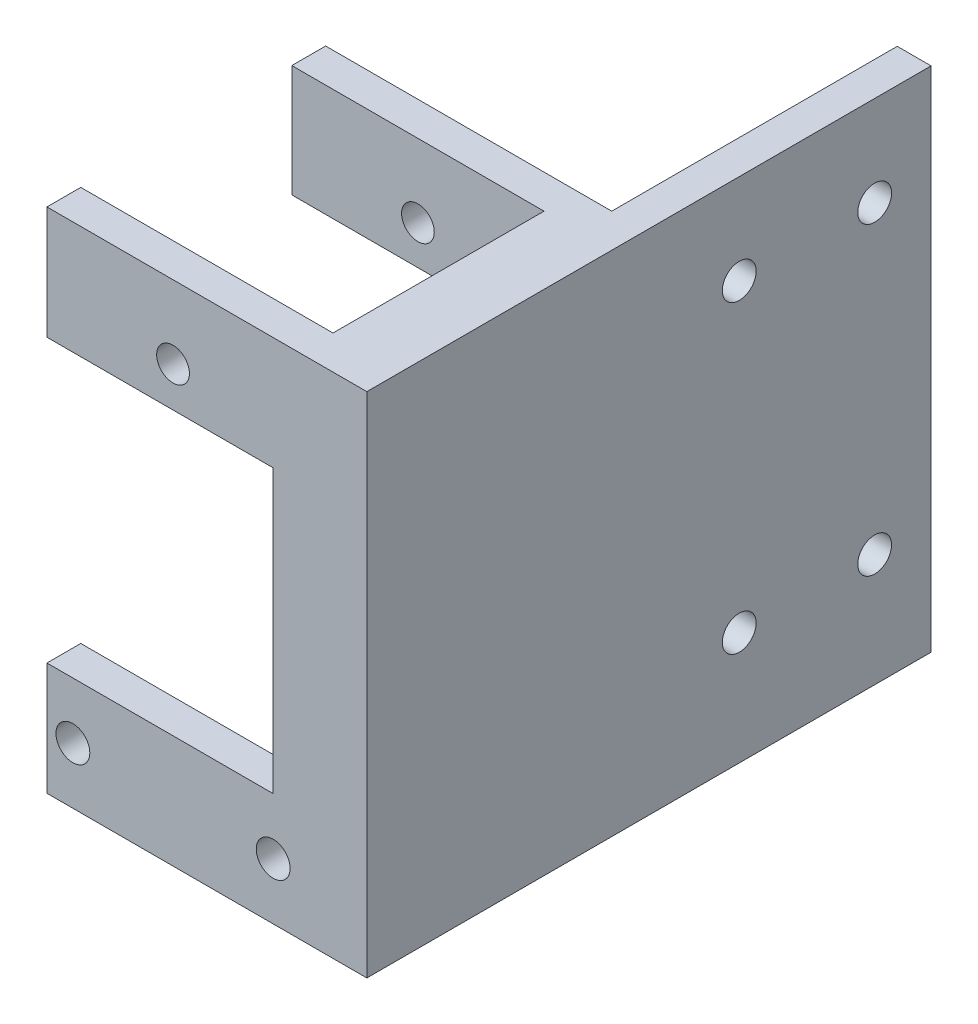
ISO-10303-21;
HEADER;
FILE_DESCRIPTION(('STEP AP214'),'2;1');
FILE_NAME('part.step','',(''),(''),'','','');
FILE_SCHEMA(('AUTOMOTIVE_DESIGN { 1 0 10303 214 1 1 1 1 }'));
ENDSEC;
DATA;
#1=APPLICATION_CONTEXT('core data for automotive mechanical design processes');
#2=APPLICATION_PROTOCOL_DEFINITION('international standard','automotive_design',2000,#1);
#3=PRODUCT_CONTEXT('',#1,'mechanical');
#4=PRODUCT('Part','Part','',(#3));
#5=PRODUCT_RELATED_PRODUCT_CATEGORY('part','',(#4));
#6=PRODUCT_DEFINITION_FORMATION('','',#4);
#7=PRODUCT_DEFINITION_CONTEXT('part definition',#1,'design');
#8=PRODUCT_DEFINITION('design','',#6,#7);
#9=PRODUCT_DEFINITION_SHAPE('','',#8);
#10=(LENGTH_UNIT() NAMED_UNIT(*) SI_UNIT(.MILLI.,.METRE.));
#11=(NAMED_UNIT(*) PLANE_ANGLE_UNIT() SI_UNIT($,.RADIAN.));
#12=(NAMED_UNIT(*) SI_UNIT($,.STERADIAN.) SOLID_ANGLE_UNIT());
#13=UNCERTAINTY_MEASURE_WITH_UNIT(LENGTH_MEASURE(1.E-05),#10,'distance_accuracy_value','');
#14=(GEOMETRIC_REPRESENTATION_CONTEXT(3) GLOBAL_UNCERTAINTY_ASSIGNED_CONTEXT((#13)) GLOBAL_UNIT_ASSIGNED_CONTEXT((#10,
#11,#12)) REPRESENTATION_CONTEXT('',''));
#15=CARTESIAN_POINT('',(0.,0.,0.));
#16=DIRECTION('',(0.,0.,1.));
#17=DIRECTION('',(1.,0.,0.));
#18=AXIS2_PLACEMENT_3D('',#15,#16,#17);
#19=CARTESIAN_POINT('',(0.,-22.5,-3.));
#20=DIRECTION('',(0.,1.,0.));
#21=DIRECTION('',(-1.,0.,0.));
#22=AXIS2_PLACEMENT_3D('',#19,#20,#21);
#23=PLANE('',#22);
#24=DIRECTION('',(0.,0.,1.));
#25=VECTOR('',#24,1.);
#26=CARTESIAN_POINT('',(9.675,-22.5,-21.7));
#27=LINE('',#26,#25);
#28=CARTESIAN_POINT('',(9.675,-22.5,-21.7));
#29=VERTEX_POINT('',#28);
#30=CARTESIAN_POINT('',(9.675,-22.5,-3.));
#31=VERTEX_POINT('',#30);
#32=EDGE_CURVE('E145',#29,#31,#27,.T.);
#33=ORIENTED_EDGE('',*,*,#32,.F.);
#34=DIRECTION('',(1.,0.,0.));
#35=VECTOR('',#34,1.);
#36=CARTESIAN_POINT('',(15.675,-22.5,-21.7));
#37=LINE('',#36,#35);
#38=CARTESIAN_POINT('',(-12.675,-22.5,-21.7));
#39=VERTEX_POINT('',#38);
#40=EDGE_CURVE('E257',#39,#29,#37,.T.);
#41=ORIENTED_EDGE('',*,*,#40,.F.);
#42=DIRECTION('',(0.,0.,1.));
#43=VECTOR('',#42,1.);
#44=CARTESIAN_POINT('',(-12.675,-22.5,-26.7));
#45=LINE('',#44,#43);
#46=CARTESIAN_POINT('',(-12.675,-22.5,-24.7));
#47=VERTEX_POINT('',#46);
#48=EDGE_CURVE('E420',#47,#39,#45,.T.);
#49=ORIENTED_EDGE('',*,*,#48,.F.);
#50=DIRECTION('',(-1.,0.,0.));
#51=VECTOR('',#50,1.);
#52=CARTESIAN_POINT('',(15.675,-22.5,-24.7));
#53=LINE('',#52,#51);
#54=CARTESIAN_POINT('',(12.675,-22.5,-24.7));
#55=VERTEX_POINT('',#54);
#56=EDGE_CURVE('E278',#55,#47,#53,.T.);
#57=ORIENTED_EDGE('',*,*,#56,.F.);
#58=DIRECTION('',(0.,0.,-1.));
#59=VECTOR('',#58,1.);
#60=CARTESIAN_POINT('',(12.675,-22.5,0.));
#61=LINE('',#60,#59);
#62=CARTESIAN_POINT('',(12.675,-22.5,-50.));
#63=VERTEX_POINT('',#62);
#64=EDGE_CURVE('E281',#55,#63,#61,.T.);
#65=ORIENTED_EDGE('',*,*,#64,.T.);
#66=DIRECTION('',(-1.,0.,0.));
#67=VECTOR('',#66,1.);
#68=CARTESIAN_POINT('',(15.675,-22.5,-50.));
#69=LINE('',#68,#67);
#70=CARTESIAN_POINT('',(15.675,-22.5,-50.));
#71=VERTEX_POINT('',#70);
#72=EDGE_CURVE('E311',#71,#63,#69,.T.);
#73=ORIENTED_EDGE('',*,*,#72,.F.);
#74=DIRECTION('',(0.,0.,-1.));
#75=VECTOR('',#74,1.);
#76=CARTESIAN_POINT('',(15.675,-22.5,0.));
#77=LINE('',#76,#75);
#78=CARTESIAN_POINT('',(15.675,-22.5,0.));
#79=VERTEX_POINT('',#78);
#80=EDGE_CURVE('E296',#79,#71,#77,.T.);
#81=ORIENTED_EDGE('',*,*,#80,.F.);
#82=DIRECTION('',(-1.,0.,0.));
#83=VECTOR('',#82,1.);
#84=CARTESIAN_POINT('',(0.,-22.5,0.));
#85=LINE('',#84,#83);
#86=CARTESIAN_POINT('',(-12.675,-22.5,0.));
#87=VERTEX_POINT('',#86);
#88=EDGE_CURVE('E358',#79,#87,#85,.T.);
#89=ORIENTED_EDGE('',*,*,#88,.T.);
#90=DIRECTION('',(0.,0.,1.));
#91=VECTOR('',#90,1.);
#92=CARTESIAN_POINT('',(-12.675,-22.5,-3.));
#93=LINE('',#92,#91);
#94=CARTESIAN_POINT('',(-12.675,-22.5,-3.));
#95=VERTEX_POINT('',#94);
#96=EDGE_CURVE('E368',#95,#87,#93,.T.);
#97=ORIENTED_EDGE('',*,*,#96,.F.);
#98=DIRECTION('',(-1.,0.,0.));
#99=VECTOR('',#98,1.);
#100=CARTESIAN_POINT('',(0.,-22.5,-3.));
#101=LINE('',#100,#99);
#102=EDGE_CURVE('E259',#31,#95,#101,.T.);
#103=ORIENTED_EDGE('',*,*,#102,.F.);
#104=EDGE_LOOP('',(#33,#41,#49,#57,#65,#73,#81,#89,#97,#103));
#105=FACE_BOUND('',#104,.T.);
#106=ADVANCED_FACE('F128',(#105),#23,.F.);
#107=CARTESIAN_POINT('',(0.,22.5,-3.));
#108=DIRECTION('',(0.,1.,0.));
#109=DIRECTION('',(-1.,0.,0.));
#110=AXIS2_PLACEMENT_3D('',#107,#108,#109);
#111=PLANE('',#110);
#112=DIRECTION('',(-1.,0.,0.));
#113=VECTOR('',#112,1.);
#114=CARTESIAN_POINT('',(15.675,22.5,-24.7));
#115=LINE('',#114,#113);
#116=CARTESIAN_POINT('',(12.675,22.5,-24.7));
#117=VERTEX_POINT('',#116);
#118=CARTESIAN_POINT('',(-12.675,22.5,-24.7));
#119=VERTEX_POINT('',#118);
#120=EDGE_CURVE('E288',#117,#119,#115,.T.);
#121=ORIENTED_EDGE('',*,*,#120,.T.);
#122=DIRECTION('',(0.,0.,1.));
#123=VECTOR('',#122,1.);
#124=CARTESIAN_POINT('',(-12.675,22.5,-26.7));
#125=LINE('',#124,#123);
#126=CARTESIAN_POINT('',(-12.675,22.5,-21.7));
#127=VERTEX_POINT('',#126);
#128=EDGE_CURVE('E422',#119,#127,#125,.T.);
#129=ORIENTED_EDGE('',*,*,#128,.T.);
#130=DIRECTION('',(1.,0.,0.));
#131=VECTOR('',#130,1.);
#132=CARTESIAN_POINT('',(15.675,22.5,-21.7));
#133=LINE('',#132,#131);
#134=CARTESIAN_POINT('',(9.675,22.5,-21.7));
#135=VERTEX_POINT('',#134);
#136=EDGE_CURVE('E284',#127,#135,#133,.T.);
#137=ORIENTED_EDGE('',*,*,#136,.T.);
#138=DIRECTION('',(0.,0.,-1.));
#139=VECTOR('',#138,1.);
#140=CARTESIAN_POINT('',(9.675,22.5,-21.7));
#141=LINE('',#140,#139);
#142=CARTESIAN_POINT('',(9.675,22.5,-3.));
#143=VERTEX_POINT('',#142);
#144=EDGE_CURVE('E266',#143,#135,#141,.T.);
#145=ORIENTED_EDGE('',*,*,#144,.F.);
#146=DIRECTION('',(-1.,0.,0.));
#147=VECTOR('',#146,1.);
#148=CARTESIAN_POINT('',(0.,22.5,-3.));
#149=LINE('',#148,#147);
#150=CARTESIAN_POINT('',(-12.675,22.5,-3.));
#151=VERTEX_POINT('',#150);
#152=EDGE_CURVE('E315',#143,#151,#149,.T.);
#153=ORIENTED_EDGE('',*,*,#152,.T.);
#154=DIRECTION('',(0.,0.,1.));
#155=VECTOR('',#154,1.);
#156=CARTESIAN_POINT('',(-12.675,22.5,-3.));
#157=LINE('',#156,#155);
#158=CARTESIAN_POINT('',(-12.675,22.5,0.));
#159=VERTEX_POINT('',#158);
#160=EDGE_CURVE('E341',#151,#159,#157,.T.);
#161=ORIENTED_EDGE('',*,*,#160,.T.);
#162=DIRECTION('',(-1.,0.,0.));
#163=VECTOR('',#162,1.);
#164=CARTESIAN_POINT('',(0.,22.5,0.));
#165=LINE('',#164,#163);
#166=CARTESIAN_POINT('',(15.675,22.5,0.));
#167=VERTEX_POINT('',#166);
#168=EDGE_CURVE('E314',#167,#159,#165,.T.);
#169=ORIENTED_EDGE('',*,*,#168,.F.);
#170=DIRECTION('',(0.,0.,1.));
#171=VECTOR('',#170,1.);
#172=CARTESIAN_POINT('',(15.675,22.5,0.));
#173=LINE('',#172,#171);
#174=CARTESIAN_POINT('',(15.675,22.5,-50.));
#175=VERTEX_POINT('',#174);
#176=EDGE_CURVE('E301',#175,#167,#173,.T.);
#177=ORIENTED_EDGE('',*,*,#176,.F.);
#178=DIRECTION('',(-1.,0.,0.));
#179=VECTOR('',#178,1.);
#180=CARTESIAN_POINT('',(15.675,22.5,-50.));
#181=LINE('',#180,#179);
#182=CARTESIAN_POINT('',(12.675,22.5,-50.));
#183=VERTEX_POINT('',#182);
#184=EDGE_CURVE('E303',#175,#183,#181,.T.);
#185=ORIENTED_EDGE('',*,*,#184,.T.);
#186=DIRECTION('',(0.,0.,1.));
#187=VECTOR('',#186,1.);
#188=CARTESIAN_POINT('',(12.675,22.5,0.));
#189=LINE('',#188,#187);
#190=EDGE_CURVE('E297',#183,#117,#189,.T.);
#191=ORIENTED_EDGE('',*,*,#190,.T.);
#192=EDGE_LOOP('',(#121,#129,#137,#145,#153,#161,#169,#177,#185,#191));
#193=FACE_BOUND('',#192,.T.);
#194=ADVANCED_FACE('F130',(#193),#111,.T.);
#195=CARTESIAN_POINT('',(15.675,-22.5,-21.7));
#196=DIRECTION('',(0.,0.,1.));
#197=DIRECTION('',(1.,0.,0.));
#198=AXIS2_PLACEMENT_3D('',#195,#196,#197);
#199=PLANE('',#198);
#200=DIRECTION('',(0.,-1.,0.));
#201=VECTOR('',#200,1.);
#202=CARTESIAN_POINT('',(9.675,22.5,-21.7));
#203=LINE('',#202,#201);
#204=EDGE_CURVE('E261',#135,#29,#203,.T.);
#205=ORIENTED_EDGE('',*,*,#204,.F.);
#206=ORIENTED_EDGE('',*,*,#136,.F.);
#207=DIRECTION('',(0.,-1.,0.));
#208=VECTOR('',#207,1.);
#209=CARTESIAN_POINT('',(-12.675,0.,-21.7));
#210=LINE('',#209,#208);
#211=CARTESIAN_POINT('',(-12.675,12.572802408595,-21.7));
#212=VERTEX_POINT('',#211);
#213=EDGE_CURVE('E414',#127,#212,#210,.T.);
#214=ORIENTED_EDGE('',*,*,#213,.T.);
#215=DIRECTION('',(1.,0.,0.));
#216=VECTOR('',#215,1.);
#217=CARTESIAN_POINT('',(0.,12.572802408595,-21.7));
#218=LINE('',#217,#216);
#219=CARTESIAN_POINT('',(7.37500000000001,12.572802408595,-21.7));
#220=VERTEX_POINT('',#219);
#221=EDGE_CURVE('E407',#212,#220,#218,.T.);
#222=ORIENTED_EDGE('',*,*,#221,.T.);
#223=DIRECTION('',(0.,1.,0.));
#224=VECTOR('',#223,1.);
#225=CARTESIAN_POINT('',(7.37500000000001,0.,-21.7));
#226=LINE('',#225,#224);
#227=CARTESIAN_POINT('',(7.37500000000001,-12.5,-21.7));
#228=VERTEX_POINT('',#227);
#229=EDGE_CURVE('E402',#228,#220,#226,.T.);
#230=ORIENTED_EDGE('',*,*,#229,.F.);
#231=DIRECTION('',(1.,0.,0.));
#232=VECTOR('',#231,1.);
#233=CARTESIAN_POINT('',(0.,-12.5,-21.7));
#234=LINE('',#233,#232);
#235=CARTESIAN_POINT('',(-12.675,-12.5,-21.7));
#236=VERTEX_POINT('',#235);
#237=EDGE_CURVE('E398',#236,#228,#234,.T.);
#238=ORIENTED_EDGE('',*,*,#237,.F.);
#239=DIRECTION('',(0.,-1.,0.));
#240=VECTOR('',#239,1.);
#241=CARTESIAN_POINT('',(-12.675,0.,-21.7));
#242=LINE('',#241,#240);
#243=EDGE_CURVE('E276',#236,#39,#242,.T.);
#244=ORIENTED_EDGE('',*,*,#243,.T.);
#245=ORIENTED_EDGE('',*,*,#40,.T.);
#246=EDGE_LOOP('',(#205,#206,#214,#222,#230,#238,#244,#245));
#247=FACE_BOUND('',#246,.T.);
#248=CARTESIAN_POINT('',(7.375,-17.5,-21.7));
#249=DIRECTION('',(0.,0.,1.));
#250=DIRECTION('',(1.,0.,0.));
#251=AXIS2_PLACEMENT_3D('',#248,#249,#250);
#252=CIRCLE('',#251,1.5);
#253=CARTESIAN_POINT('',(8.875,-17.5,-21.7));
#254=VERTEX_POINT('',#253);
#255=EDGE_CURVE('E502',#254,#254,#252,.T.);
#256=ORIENTED_EDGE('',*,*,#255,.F.);
#257=EDGE_LOOP('',(#256));
#258=FACE_BOUND('',#257,.T.);
#259=CARTESIAN_POINT('',(-10.375,-17.5,-21.7));
#260=DIRECTION('',(0.,0.,1.));
#261=DIRECTION('',(1.,0.,0.));
#262=AXIS2_PLACEMENT_3D('',#259,#260,#261);
#263=CIRCLE('',#262,1.5);
#264=CARTESIAN_POINT('',(-8.875,-17.5,-21.7));
#265=VERTEX_POINT('',#264);
#266=EDGE_CURVE('E501',#265,#265,#263,.T.);
#267=ORIENTED_EDGE('',*,*,#266,.F.);
#268=EDGE_LOOP('',(#267));
#269=FACE_BOUND('',#268,.T.);
#270=CARTESIAN_POINT('',(-1.49999999999866,16.0249999999949,-21.7));
#271=DIRECTION('',(0.,0.,1.));
#272=DIRECTION('',(1.,0.,0.));
#273=AXIS2_PLACEMENT_3D('',#270,#271,#272);
#274=CIRCLE('',#273,1.4500000000001);
#275=CARTESIAN_POINT('',(-0.049999999998559,16.0249999999949,-21.7));
#276=VERTEX_POINT('',#275);
#277=EDGE_CURVE('E393',#276,#276,#274,.T.);
#278=ORIENTED_EDGE('',*,*,#277,.F.);
#279=EDGE_LOOP('',(#278));
#280=FACE_BOUND('',#279,.T.);
#281=ADVANCED_FACE('F272',(#247,#258,#269,#280),#199,.T.);
#282=CARTESIAN_POINT('',(15.675,-22.5,-24.7));
#283=DIRECTION('',(0.,0.,-1.));
#284=DIRECTION('',(-1.,0.,0.));
#285=AXIS2_PLACEMENT_3D('',#282,#283,#284);
#286=PLANE('',#285);
#287=CARTESIAN_POINT('',(7.375,-17.5,-24.7));
#288=DIRECTION('',(0.,0.,-1.));
#289=DIRECTION('',(-1.,0.,0.));
#290=AXIS2_PLACEMENT_3D('',#287,#288,#289);
#291=CIRCLE('',#290,1.5);
#292=CARTESIAN_POINT('',(5.875,-17.5,-24.7));
#293=VERTEX_POINT('',#292);
#294=EDGE_CURVE('E132',#293,#293,#291,.T.);
#295=ORIENTED_EDGE('',*,*,#294,.F.);
#296=EDGE_LOOP('',(#295));
#297=FACE_BOUND('',#296,.T.);
#298=CARTESIAN_POINT('',(-10.375,-17.5,-24.7));
#299=DIRECTION('',(0.,0.,-1.));
#300=DIRECTION('',(-1.,0.,0.));
#301=AXIS2_PLACEMENT_3D('',#298,#299,#300);
#302=CIRCLE('',#301,1.5);
#303=CARTESIAN_POINT('',(-11.875,-17.5,-24.7));
#304=VERTEX_POINT('',#303);
#305=EDGE_CURVE('E392',#304,#304,#302,.T.);
#306=ORIENTED_EDGE('',*,*,#305,.F.);
#307=EDGE_LOOP('',(#306));
#308=FACE_BOUND('',#307,.T.);
#309=CARTESIAN_POINT('',(-1.49999999999866,16.0249999999949,-24.7));
#310=DIRECTION('',(0.,0.,-1.));
#311=DIRECTION('',(-1.,0.,0.));
#312=AXIS2_PLACEMENT_3D('',#309,#310,#311);
#313=CIRCLE('',#312,1.4500000000001);
#314=CARTESIAN_POINT('',(-2.94999999999875,16.0249999999949,-24.7));
#315=VERTEX_POINT('',#314);
#316=EDGE_CURVE('E390',#315,#315,#313,.T.);
#317=ORIENTED_EDGE('',*,*,#316,.F.);
#318=EDGE_LOOP('',(#317));
#319=FACE_BOUND('',#318,.T.);
#320=ORIENTED_EDGE('',*,*,#56,.T.);
#321=DIRECTION('',(0.,1.,0.));
#322=VECTOR('',#321,1.);
#323=CARTESIAN_POINT('',(-12.675,-22.5,-24.7));
#324=LINE('',#323,#322);
#325=CARTESIAN_POINT('',(-12.675,-12.5,-24.7));
#326=VERTEX_POINT('',#325);
#327=EDGE_CURVE('E12',#47,#326,#324,.T.);
#328=ORIENTED_EDGE('',*,*,#327,.T.);
#329=DIRECTION('',(-1.,0.,0.));
#330=VECTOR('',#329,1.);
#331=CARTESIAN_POINT('',(15.675,-12.5,-24.7));
#332=LINE('',#331,#330);
#333=CARTESIAN_POINT('',(7.37500000000001,-12.5,-24.7));
#334=VERTEX_POINT('',#333);
#335=EDGE_CURVE('E137',#334,#326,#332,.T.);
#336=ORIENTED_EDGE('',*,*,#335,.F.);
#337=DIRECTION('',(0.,-1.,0.));
#338=VECTOR('',#337,1.);
#339=CARTESIAN_POINT('',(7.37500000000001,-22.5,-24.7));
#340=LINE('',#339,#338);
#341=CARTESIAN_POINT('',(7.37500000000001,12.572802408595,-24.7));
#342=VERTEX_POINT('',#341);
#343=EDGE_CURVE('E371',#342,#334,#340,.T.);
#344=ORIENTED_EDGE('',*,*,#343,.F.);
#345=DIRECTION('',(-1.,0.,0.));
#346=VECTOR('',#345,1.);
#347=CARTESIAN_POINT('',(15.675,12.572802408595,-24.7));
#348=LINE('',#347,#346);
#349=CARTESIAN_POINT('',(-12.675,12.572802408595,-24.7));
#350=VERTEX_POINT('',#349);
#351=EDGE_CURVE('E383',#342,#350,#348,.T.);
#352=ORIENTED_EDGE('',*,*,#351,.T.);
#353=DIRECTION('',(0.,1.,0.));
#354=VECTOR('',#353,1.);
#355=CARTESIAN_POINT('',(-12.675,-22.5,-24.7));
#356=LINE('',#355,#354);
#357=EDGE_CURVE('E386',#350,#119,#356,.T.);
#358=ORIENTED_EDGE('',*,*,#357,.T.);
#359=ORIENTED_EDGE('',*,*,#120,.F.);
#360=DIRECTION('',(0.,1.,0.));
#361=VECTOR('',#360,1.);
#362=CARTESIAN_POINT('',(12.675,0.,-24.7));
#363=LINE('',#362,#361);
#364=EDGE_CURVE('E277',#55,#117,#363,.T.);
#365=ORIENTED_EDGE('',*,*,#364,.F.);
#366=EDGE_LOOP('',(#320,#328,#336,#344,#352,#358,#359,#365));
#367=FACE_BOUND('',#366,.T.);
#368=ADVANCED_FACE('F433',(#297,#308,#319,#367),#286,.T.);
#369=CARTESIAN_POINT('',(-12.675,0.,-3.));
#370=DIRECTION('',(1.,0.,0.));
#371=DIRECTION('',(0.,0.,-1.));
#372=AXIS2_PLACEMENT_3D('',#369,#370,#371);
#373=PLANE('',#372);
#374=DIRECTION('',(0.,1.,0.));
#375=VECTOR('',#374,1.);
#376=CARTESIAN_POINT('',(-12.675,0.,0.));
#377=LINE('',#376,#375);
#378=CARTESIAN_POINT('',(-12.675,-12.5,0.));
#379=VERTEX_POINT('',#378);
#380=EDGE_CURVE('E356',#87,#379,#377,.T.);
#381=ORIENTED_EDGE('',*,*,#380,.T.);
#382=DIRECTION('',(0.,0.,1.));
#383=VECTOR('',#382,1.);
#384=CARTESIAN_POINT('',(-12.675,-12.5,-3.));
#385=LINE('',#384,#383);
#386=CARTESIAN_POINT('',(-12.675,-12.5,-3.));
#387=VERTEX_POINT('',#386);
#388=EDGE_CURVE('E372',#387,#379,#385,.T.);
#389=ORIENTED_EDGE('',*,*,#388,.F.);
#390=DIRECTION('',(0.,1.,0.));
#391=VECTOR('',#390,1.);
#392=CARTESIAN_POINT('',(-12.675,0.,-3.));
#393=LINE('',#392,#391);
#394=EDGE_CURVE('E329',#95,#387,#393,.T.);
#395=ORIENTED_EDGE('',*,*,#394,.F.);
#396=ORIENTED_EDGE('',*,*,#96,.T.);
#397=EDGE_LOOP('',(#381,#389,#395,#396));
#398=FACE_BOUND('',#397,.T.);
#399=ADVANCED_FACE('F458',(#398),#373,.F.);
#400=CARTESIAN_POINT('',(0.,-12.5,-3.));
#401=DIRECTION('',(0.,-1.,0.));
#402=DIRECTION('',(0.,0.,-1.));
#403=AXIS2_PLACEMENT_3D('',#400,#401,#402);
#404=PLANE('',#403);
#405=DIRECTION('',(1.,0.,0.));
#406=VECTOR('',#405,1.);
#407=CARTESIAN_POINT('',(0.,-12.5,0.));
#408=LINE('',#407,#406);
#409=CARTESIAN_POINT('',(7.37500000000001,-12.5,0.));
#410=VERTEX_POINT('',#409);
#411=EDGE_CURVE('E353',#379,#410,#408,.T.);
#412=ORIENTED_EDGE('',*,*,#411,.T.);
#413=DIRECTION('',(0.,0.,1.));
#414=VECTOR('',#413,1.);
#415=CARTESIAN_POINT('',(7.37500000000001,-12.5,-3.));
#416=LINE('',#415,#414);
#417=CARTESIAN_POINT('',(7.37500000000001,-12.5,-3.));
#418=VERTEX_POINT('',#417);
#419=EDGE_CURVE('E375',#418,#410,#416,.T.);
#420=ORIENTED_EDGE('',*,*,#419,.F.);
#421=DIRECTION('',(1.,0.,0.));
#422=VECTOR('',#421,1.);
#423=CARTESIAN_POINT('',(0.,-12.5,-3.));
#424=LINE('',#423,#422);
#425=EDGE_CURVE('E327',#387,#418,#424,.T.);
#426=ORIENTED_EDGE('',*,*,#425,.F.);
#427=ORIENTED_EDGE('',*,*,#388,.T.);
#428=EDGE_LOOP('',(#412,#420,#426,#427));
#429=FACE_BOUND('',#428,.T.);
#430=ADVANCED_FACE('F466',(#429),#404,.F.);
#431=CARTESIAN_POINT('',(7.375,0.,-3.));
#432=DIRECTION('',(-1.,0.,0.));
#433=DIRECTION('',(0.,-1.,0.));
#434=AXIS2_PLACEMENT_3D('',#431,#432,#433);
#435=PLANE('',#434);
#436=DIRECTION('',(0.,-1.,0.));
#437=VECTOR('',#436,1.);
#438=CARTESIAN_POINT('',(7.375,0.,0.));
#439=LINE('',#438,#437);
#440=CARTESIAN_POINT('',(7.375,12.5,0.));
#441=VERTEX_POINT('',#440);
#442=EDGE_CURVE('E350',#441,#410,#439,.T.);
#443=ORIENTED_EDGE('',*,*,#442,.F.);
#444=DIRECTION('',(0.,0.,1.));
#445=VECTOR('',#444,1.);
#446=CARTESIAN_POINT('',(7.375,12.5,-3.));
#447=LINE('',#446,#445);
#448=CARTESIAN_POINT('',(7.375,12.5,-3.));
#449=VERTEX_POINT('',#448);
#450=EDGE_CURVE('E377',#449,#441,#447,.T.);
#451=ORIENTED_EDGE('',*,*,#450,.F.);
#452=DIRECTION('',(0.,-1.,0.));
#453=VECTOR('',#452,1.);
#454=CARTESIAN_POINT('',(7.375,0.,-3.));
#455=LINE('',#454,#453);
#456=EDGE_CURVE('E324',#449,#418,#455,.T.);
#457=ORIENTED_EDGE('',*,*,#456,.T.);
#458=ORIENTED_EDGE('',*,*,#419,.T.);
#459=EDGE_LOOP('',(#443,#451,#457,#458));
#460=FACE_BOUND('',#459,.T.);
#461=ADVANCED_FACE('F543',(#460),#435,.T.);
#462=CARTESIAN_POINT('',(0.,12.5,-3.));
#463=DIRECTION('',(0.,-1.,0.));
#464=DIRECTION('',(0.,0.,-1.));
#465=AXIS2_PLACEMENT_3D('',#462,#463,#464);
#466=PLANE('',#465);
#467=DIRECTION('',(1.,0.,0.));
#468=VECTOR('',#467,1.);
#469=CARTESIAN_POINT('',(0.,12.5,0.));
#470=LINE('',#469,#468);
#471=CARTESIAN_POINT('',(-12.675,12.5,0.));
#472=VERTEX_POINT('',#471);
#473=EDGE_CURVE('E347',#472,#441,#470,.T.);
#474=ORIENTED_EDGE('',*,*,#473,.F.);
#475=DIRECTION('',(0.,0.,1.));
#476=VECTOR('',#475,1.);
#477=CARTESIAN_POINT('',(-12.675,12.5,-3.));
#478=LINE('',#477,#476);
#479=CARTESIAN_POINT('',(-12.675,12.5,-3.));
#480=VERTEX_POINT('',#479);
#481=EDGE_CURVE('E379',#480,#472,#478,.T.);
#482=ORIENTED_EDGE('',*,*,#481,.F.);
#483=DIRECTION('',(1.,0.,0.));
#484=VECTOR('',#483,1.);
#485=CARTESIAN_POINT('',(0.,12.5,-3.));
#486=LINE('',#485,#484);
#487=EDGE_CURVE('E321',#480,#449,#486,.T.);
#488=ORIENTED_EDGE('',*,*,#487,.T.);
#489=ORIENTED_EDGE('',*,*,#450,.T.);
#490=EDGE_LOOP('',(#474,#482,#488,#489));
#491=FACE_BOUND('',#490,.T.);
#492=ADVANCED_FACE('F546',(#491),#466,.T.);
#493=CARTESIAN_POINT('',(-12.675,0.,-3.));
#494=DIRECTION('',(1.,0.,0.));
#495=DIRECTION('',(0.,0.,-1.));
#496=AXIS2_PLACEMENT_3D('',#493,#494,#495);
#497=PLANE('',#496);
#498=DIRECTION('',(0.,1.,0.));
#499=VECTOR('',#498,1.);
#500=CARTESIAN_POINT('',(-12.675,0.,0.));
#501=LINE('',#500,#499);
#502=EDGE_CURVE('E344',#472,#159,#501,.T.);
#503=ORIENTED_EDGE('',*,*,#502,.T.);
#504=ORIENTED_EDGE('',*,*,#160,.F.);
#505=DIRECTION('',(0.,1.,0.));
#506=VECTOR('',#505,1.);
#507=CARTESIAN_POINT('',(-12.675,0.,-3.));
#508=LINE('',#507,#506);
#509=EDGE_CURVE('E317',#480,#151,#508,.T.);
#510=ORIENTED_EDGE('',*,*,#509,.F.);
#511=ORIENTED_EDGE('',*,*,#481,.T.);
#512=EDGE_LOOP('',(#503,#504,#510,#511));
#513=FACE_BOUND('',#512,.T.);
#514=ADVANCED_FACE('F549',(#513),#497,.F.);
#515=CARTESIAN_POINT('',(7.375,-17.5,-3.));
#516=DIRECTION('',(0.,0.,1.));
#517=DIRECTION('',(1.,0.,0.));
#518=AXIS2_PLACEMENT_3D('',#515,#516,#517);
#519=CYLINDRICAL_SURFACE('',#518,1.5);
#520=CARTESIAN_POINT('',(7.375,-17.5,-3.));
#521=DIRECTION('',(0.,0.,1.));
#522=DIRECTION('',(1.,0.,0.));
#523=AXIS2_PLACEMENT_3D('',#520,#521,#522);
#524=CIRCLE('',#523,1.5);
#525=CARTESIAN_POINT('',(8.875,-17.5,-3.));
#526=VERTEX_POINT('',#525);
#527=EDGE_CURVE('E335',#526,#526,#524,.T.);
#528=ORIENTED_EDGE('',*,*,#527,.F.);
#529=EDGE_LOOP('',(#528));
#530=FACE_BOUND('',#529,.T.);
#531=CARTESIAN_POINT('',(7.375,-17.5,0.));
#532=DIRECTION('',(0.,0.,1.));
#533=DIRECTION('',(1.,0.,0.));
#534=AXIS2_PLACEMENT_3D('',#531,#532,#533);
#535=CIRCLE('',#534,1.5);
#536=CARTESIAN_POINT('',(8.875,-17.5,0.));
#537=VERTEX_POINT('',#536);
#538=EDGE_CURVE('E363',#537,#537,#535,.T.);
#539=ORIENTED_EDGE('',*,*,#538,.T.);
#540=EDGE_LOOP('',(#539));
#541=FACE_BOUND('',#540,.T.);
#542=ADVANCED_FACE('F552',(#530,#541),#519,.F.);
#543=CARTESIAN_POINT('',(-10.375,-17.5,-3.));
#544=DIRECTION('',(0.,0.,1.));
#545=DIRECTION('',(1.,0.,0.));
#546=AXIS2_PLACEMENT_3D('',#543,#544,#545);
#547=CYLINDRICAL_SURFACE('',#546,1.5);
#548=CARTESIAN_POINT('',(-10.375,-17.5,-3.));
#549=DIRECTION('',(0.,0.,1.));
#550=DIRECTION('',(1.,0.,0.));
#551=AXIS2_PLACEMENT_3D('',#548,#549,#550);
#552=CIRCLE('',#551,1.5);
#553=CARTESIAN_POINT('',(-8.875,-17.5,-3.));
#554=VERTEX_POINT('',#553);
#555=EDGE_CURVE('E332',#554,#554,#552,.T.);
#556=ORIENTED_EDGE('',*,*,#555,.F.);
#557=EDGE_LOOP('',(#556));
#558=FACE_BOUND('',#557,.T.);
#559=CARTESIAN_POINT('',(-10.375,-17.5,0.));
#560=DIRECTION('',(0.,0.,1.));
#561=DIRECTION('',(1.,0.,0.));
#562=AXIS2_PLACEMENT_3D('',#559,#560,#561);
#563=CIRCLE('',#562,1.5);
#564=CARTESIAN_POINT('',(-8.875,-17.5,0.));
#565=VERTEX_POINT('',#564);
#566=EDGE_CURVE('E360',#565,#565,#563,.T.);
#567=ORIENTED_EDGE('',*,*,#566,.T.);
#568=EDGE_LOOP('',(#567));
#569=FACE_BOUND('',#568,.T.);
#570=ADVANCED_FACE('F537',(#558,#569),#547,.F.);
#571=CARTESIAN_POINT('',(-1.49999999999889,16.0249999999953,-3.));
#572=DIRECTION('',(0.,0.,1.));
#573=DIRECTION('',(1.,0.,0.));
#574=AXIS2_PLACEMENT_3D('',#571,#572,#573);
#575=CYLINDRICAL_SURFACE('',#574,1.45000000000021);
#576=CARTESIAN_POINT('',(-1.49999999999889,16.0249999999953,-3.));
#577=DIRECTION('',(0.,0.,1.));
#578=DIRECTION('',(1.,0.,0.));
#579=AXIS2_PLACEMENT_3D('',#576,#577,#578);
#580=CIRCLE('',#579,1.45000000000021);
#581=CARTESIAN_POINT('',(-0.0499999999986828,16.0249999999953,-3.));
#582=VERTEX_POINT('',#581);
#583=EDGE_CURVE('E338',#582,#582,#580,.T.);
#584=ORIENTED_EDGE('',*,*,#583,.F.);
#585=EDGE_LOOP('',(#584));
#586=FACE_BOUND('',#585,.T.);
#587=CARTESIAN_POINT('',(-1.49999999999889,16.0249999999953,0.));
#588=DIRECTION('',(0.,0.,1.));
#589=DIRECTION('',(1.,0.,0.));
#590=AXIS2_PLACEMENT_3D('',#587,#588,#589);
#591=CIRCLE('',#590,1.45000000000021);
#592=CARTESIAN_POINT('',(-0.0499999999986828,16.0249999999953,0.));
#593=VERTEX_POINT('',#592);
#594=EDGE_CURVE('E318',#593,#593,#591,.T.);
#595=ORIENTED_EDGE('',*,*,#594,.T.);
#596=EDGE_LOOP('',(#595));
#597=FACE_BOUND('',#596,.T.);
#598=ADVANCED_FACE('F588',(#586,#597),#575,.F.);
#599=CARTESIAN_POINT('',(0.,0.,-3.));
#600=DIRECTION('',(0.,0.,1.));
#601=DIRECTION('',(1.,0.,0.));
#602=AXIS2_PLACEMENT_3D('',#599,#600,#601);
#603=PLANE('',#602);
#604=ORIENTED_EDGE('',*,*,#152,.F.);
#605=DIRECTION('',(0.,1.,0.));
#606=VECTOR('',#605,1.);
#607=CARTESIAN_POINT('',(9.675,22.5,-3.));
#608=LINE('',#607,#606);
#609=EDGE_CURVE('E260',#31,#143,#608,.T.);
#610=ORIENTED_EDGE('',*,*,#609,.F.);
#611=ORIENTED_EDGE('',*,*,#102,.T.);
#612=ORIENTED_EDGE('',*,*,#394,.T.);
#613=ORIENTED_EDGE('',*,*,#425,.T.);
#614=ORIENTED_EDGE('',*,*,#456,.F.);
#615=ORIENTED_EDGE('',*,*,#487,.F.);
#616=ORIENTED_EDGE('',*,*,#509,.T.);
#617=EDGE_LOOP('',(#604,#610,#611,#612,#613,#614,#615,#616));
#618=FACE_BOUND('',#617,.T.);
#619=ORIENTED_EDGE('',*,*,#555,.T.);
#620=EDGE_LOOP('',(#619));
#621=FACE_BOUND('',#620,.T.);
#622=ORIENTED_EDGE('',*,*,#527,.T.);
#623=EDGE_LOOP('',(#622));
#624=FACE_BOUND('',#623,.T.);
#625=ORIENTED_EDGE('',*,*,#583,.T.);
#626=EDGE_LOOP('',(#625));
#627=FACE_BOUND('',#626,.T.);
#628=ADVANCED_FACE('F471',(#618,#621,#624,#627),#603,.F.);
#629=CARTESIAN_POINT('',(0.,0.,0.));
#630=DIRECTION('',(0.,0.,1.));
#631=DIRECTION('',(1.,0.,0.));
#632=AXIS2_PLACEMENT_3D('',#629,#630,#631);
#633=PLANE('',#632);
#634=ORIENTED_EDGE('',*,*,#88,.F.);
#635=DIRECTION('',(0.,-1.,0.));
#636=VECTOR('',#635,1.);
#637=CARTESIAN_POINT('',(15.675,22.5,0.));
#638=LINE('',#637,#636);
#639=EDGE_CURVE('E293',#167,#79,#638,.T.);
#640=ORIENTED_EDGE('',*,*,#639,.F.);
#641=ORIENTED_EDGE('',*,*,#168,.T.);
#642=ORIENTED_EDGE('',*,*,#502,.F.);
#643=ORIENTED_EDGE('',*,*,#473,.T.);
#644=ORIENTED_EDGE('',*,*,#442,.T.);
#645=ORIENTED_EDGE('',*,*,#411,.F.);
#646=ORIENTED_EDGE('',*,*,#380,.F.);
#647=EDGE_LOOP('',(#634,#640,#641,#642,#643,#644,#645,#646));
#648=FACE_BOUND('',#647,.T.);
#649=ORIENTED_EDGE('',*,*,#566,.F.);
#650=EDGE_LOOP('',(#649));
#651=FACE_BOUND('',#650,.T.);
#652=ORIENTED_EDGE('',*,*,#538,.F.);
#653=EDGE_LOOP('',(#652));
#654=FACE_BOUND('',#653,.T.);
#655=ORIENTED_EDGE('',*,*,#594,.F.);
#656=EDGE_LOOP('',(#655));
#657=FACE_BOUND('',#656,.T.);
#658=ADVANCED_FACE('F461',(#648,#651,#654,#657),#633,.T.);
#659=CARTESIAN_POINT('',(12.675,0.,0.));
#660=DIRECTION('',(1.,0.,0.));
#661=DIRECTION('',(0.,0.,-1.));
#662=AXIS2_PLACEMENT_3D('',#659,#660,#661);
#663=PLANE('',#662);
#664=CARTESIAN_POINT('',(12.675,14.5,-33.));
#665=DIRECTION('',(1.,0.,0.));
#666=DIRECTION('',(0.,0.,-1.));
#667=AXIS2_PLACEMENT_3D('',#664,#665,#666);
#668=CIRCLE('',#667,1.5);
#669=CARTESIAN_POINT('',(12.675,14.5,-34.5));
#670=VERTEX_POINT('',#669);
#671=EDGE_CURVE('E498',#670,#670,#668,.T.);
#672=ORIENTED_EDGE('',*,*,#671,.T.);
#673=EDGE_LOOP('',(#672));
#674=FACE_BOUND('',#673,.T.);
#675=CARTESIAN_POINT('',(12.675,14.5,-45.));
#676=DIRECTION('',(1.,0.,0.));
#677=DIRECTION('',(0.,0.,-1.));
#678=AXIS2_PLACEMENT_3D('',#675,#676,#677);
#679=CIRCLE('',#678,1.5);
#680=CARTESIAN_POINT('',(12.675,14.5,-46.5));
#681=VERTEX_POINT('',#680);
#682=EDGE_CURVE('E495',#681,#681,#679,.T.);
#683=ORIENTED_EDGE('',*,*,#682,.T.);
#684=EDGE_LOOP('',(#683));
#685=FACE_BOUND('',#684,.T.);
#686=CARTESIAN_POINT('',(12.675,-12.5,-45.));
#687=DIRECTION('',(1.,0.,0.));
#688=DIRECTION('',(0.,0.,-1.));
#689=AXIS2_PLACEMENT_3D('',#686,#687,#688);
#690=CIRCLE('',#689,1.5);
#691=CARTESIAN_POINT('',(12.675,-12.5,-46.5));
#692=VERTEX_POINT('',#691);
#693=EDGE_CURVE('E492',#692,#692,#690,.T.);
#694=ORIENTED_EDGE('',*,*,#693,.T.);
#695=EDGE_LOOP('',(#694));
#696=FACE_BOUND('',#695,.T.);
#697=CARTESIAN_POINT('',(12.675,-12.5,-33.));
#698=DIRECTION('',(1.,0.,0.));
#699=DIRECTION('',(0.,0.,-1.));
#700=AXIS2_PLACEMENT_3D('',#697,#698,#699);
#701=CIRCLE('',#700,1.5);
#702=CARTESIAN_POINT('',(12.675,-12.5,-34.5));
#703=VERTEX_POINT('',#702);
#704=EDGE_CURVE('E489',#703,#703,#701,.T.);
#705=ORIENTED_EDGE('',*,*,#704,.T.);
#706=EDGE_LOOP('',(#705));
#707=FACE_BOUND('',#706,.T.);
#708=ORIENTED_EDGE('',*,*,#64,.F.);
#709=ORIENTED_EDGE('',*,*,#364,.T.);
#710=ORIENTED_EDGE('',*,*,#190,.F.);
#711=DIRECTION('',(0.,1.,0.));
#712=VECTOR('',#711,1.);
#713=CARTESIAN_POINT('',(12.675,22.5,-50.));
#714=LINE('',#713,#712);
#715=EDGE_CURVE('E305',#63,#183,#714,.T.);
#716=ORIENTED_EDGE('',*,*,#715,.F.);
#717=EDGE_LOOP('',(#708,#709,#710,#716));
#718=FACE_BOUND('',#717,.T.);
#719=ADVANCED_FACE('F441',(#674,#685,#696,#707,#718),#663,.F.);
#720=CARTESIAN_POINT('',(15.675,22.5,-50.));
#721=DIRECTION('',(0.,0.,1.));
#722=DIRECTION('',(1.,0.,0.));
#723=AXIS2_PLACEMENT_3D('',#720,#721,#722);
#724=PLANE('',#723);
#725=ORIENTED_EDGE('',*,*,#715,.T.);
#726=ORIENTED_EDGE('',*,*,#184,.F.);
#727=DIRECTION('',(0.,1.,0.));
#728=VECTOR('',#727,1.);
#729=CARTESIAN_POINT('',(15.675,22.5,-50.));
#730=LINE('',#729,#728);
#731=EDGE_CURVE('E299',#71,#175,#730,.T.);
#732=ORIENTED_EDGE('',*,*,#731,.F.);
#733=ORIENTED_EDGE('',*,*,#72,.T.);
#734=EDGE_LOOP('',(#725,#726,#732,#733));
#735=FACE_BOUND('',#734,.T.);
#736=ADVANCED_FACE('F445',(#735),#724,.F.);
#737=CARTESIAN_POINT('',(15.675,0.,0.));
#738=DIRECTION('',(1.,0.,0.));
#739=DIRECTION('',(0.,0.,-1.));
#740=AXIS2_PLACEMENT_3D('',#737,#738,#739);
#741=PLANE('',#740);
#742=CARTESIAN_POINT('',(15.675,14.5,-33.));
#743=DIRECTION('',(1.,0.,0.));
#744=DIRECTION('',(0.,0.,-1.));
#745=AXIS2_PLACEMENT_3D('',#742,#743,#744);
#746=CIRCLE('',#745,1.5);
#747=CARTESIAN_POINT('',(15.675,14.5,-34.5));
#748=VERTEX_POINT('',#747);
#749=EDGE_CURVE('E475',#748,#748,#746,.T.);
#750=ORIENTED_EDGE('',*,*,#749,.F.);
#751=EDGE_LOOP('',(#750));
#752=FACE_BOUND('',#751,.T.);
#753=CARTESIAN_POINT('',(15.675,14.5,-45.));
#754=DIRECTION('',(1.,0.,0.));
#755=DIRECTION('',(0.,0.,-1.));
#756=AXIS2_PLACEMENT_3D('',#753,#754,#755);
#757=CIRCLE('',#756,1.5);
#758=CARTESIAN_POINT('',(15.675,14.5,-46.5));
#759=VERTEX_POINT('',#758);
#760=EDGE_CURVE('E482',#759,#759,#757,.T.);
#761=ORIENTED_EDGE('',*,*,#760,.F.);
#762=EDGE_LOOP('',(#761));
#763=FACE_BOUND('',#762,.T.);
#764=CARTESIAN_POINT('',(15.675,-12.5,-45.));
#765=DIRECTION('',(1.,0.,0.));
#766=DIRECTION('',(0.,0.,-1.));
#767=AXIS2_PLACEMENT_3D('',#764,#765,#766);
#768=CIRCLE('',#767,1.5);
#769=CARTESIAN_POINT('',(15.675,-12.5,-46.5));
#770=VERTEX_POINT('',#769);
#771=EDGE_CURVE('E478',#770,#770,#768,.T.);
#772=ORIENTED_EDGE('',*,*,#771,.F.);
#773=EDGE_LOOP('',(#772));
#774=FACE_BOUND('',#773,.T.);
#775=CARTESIAN_POINT('',(15.675,-12.5,-33.));
#776=DIRECTION('',(1.,0.,0.));
#777=DIRECTION('',(0.,0.,-1.));
#778=AXIS2_PLACEMENT_3D('',#775,#776,#777);
#779=CIRCLE('',#778,1.5);
#780=CARTESIAN_POINT('',(15.675,-12.5,-34.5));
#781=VERTEX_POINT('',#780);
#782=EDGE_CURVE('E481',#781,#781,#779,.T.);
#783=ORIENTED_EDGE('',*,*,#782,.F.);
#784=EDGE_LOOP('',(#783));
#785=FACE_BOUND('',#784,.T.);
#786=ORIENTED_EDGE('',*,*,#176,.T.);
#787=ORIENTED_EDGE('',*,*,#639,.T.);
#788=ORIENTED_EDGE('',*,*,#80,.T.);
#789=ORIENTED_EDGE('',*,*,#731,.T.);
#790=EDGE_LOOP('',(#786,#787,#788,#789));
#791=FACE_BOUND('',#790,.T.);
#792=ADVANCED_FACE('F452',(#752,#763,#774,#785,#791),#741,.T.);
#793=CARTESIAN_POINT('',(0.,-12.5,-26.7));
#794=DIRECTION('',(0.,-1.,0.));
#795=DIRECTION('',(0.,0.,-1.));
#796=AXIS2_PLACEMENT_3D('',#793,#794,#795);
#797=PLANE('',#796);
#798=ORIENTED_EDGE('',*,*,#335,.T.);
#799=DIRECTION('',(0.,0.,1.));
#800=VECTOR('',#799,1.);
#801=CARTESIAN_POINT('',(-12.675,-12.5,-26.7));
#802=LINE('',#801,#800);
#803=EDGE_CURVE('E291',#326,#236,#802,.T.);
#804=ORIENTED_EDGE('',*,*,#803,.T.);
#805=ORIENTED_EDGE('',*,*,#237,.T.);
#806=DIRECTION('',(0.,0.,1.));
#807=VECTOR('',#806,1.);
#808=CARTESIAN_POINT('',(7.37500000000001,-12.5,-26.7));
#809=LINE('',#808,#807);
#810=EDGE_CURVE('E418',#334,#228,#809,.T.);
#811=ORIENTED_EDGE('',*,*,#810,.F.);
#812=EDGE_LOOP('',(#798,#804,#805,#811));
#813=FACE_BOUND('',#812,.T.);
#814=ADVANCED_FACE('F430',(#813),#797,.F.);
#815=CARTESIAN_POINT('',(-12.675,0.,-26.7));
#816=DIRECTION('',(-1.,0.,0.));
#817=DIRECTION('',(0.,-1.,0.));
#818=AXIS2_PLACEMENT_3D('',#815,#816,#817);
#819=PLANE('',#818);
#820=ORIENTED_EDGE('',*,*,#48,.T.);
#821=ORIENTED_EDGE('',*,*,#243,.F.);
#822=ORIENTED_EDGE('',*,*,#803,.F.);
#823=ORIENTED_EDGE('',*,*,#327,.F.);
#824=EDGE_LOOP('',(#820,#821,#822,#823));
#825=FACE_BOUND('',#824,.T.);
#826=ADVANCED_FACE('F436',(#825),#819,.T.);
#827=CARTESIAN_POINT('',(-12.675,0.,-26.7));
#828=DIRECTION('',(-1.,0.,0.));
#829=DIRECTION('',(0.,-1.,0.));
#830=AXIS2_PLACEMENT_3D('',#827,#828,#829);
#831=PLANE('',#830);
#832=DIRECTION('',(0.,0.,1.));
#833=VECTOR('',#832,1.);
#834=CARTESIAN_POINT('',(-12.675,12.572802408595,-26.7));
#835=LINE('',#834,#833);
#836=EDGE_CURVE('E425',#350,#212,#835,.T.);
#837=ORIENTED_EDGE('',*,*,#836,.T.);
#838=ORIENTED_EDGE('',*,*,#213,.F.);
#839=ORIENTED_EDGE('',*,*,#128,.F.);
#840=ORIENTED_EDGE('',*,*,#357,.F.);
#841=EDGE_LOOP('',(#837,#838,#839,#840));
#842=FACE_BOUND('',#841,.T.);
#843=ADVANCED_FACE('F564',(#842),#831,.T.);
#844=CARTESIAN_POINT('',(0.,12.572802408595,-26.7));
#845=DIRECTION('',(0.,-1.,0.));
#846=DIRECTION('',(0.,0.,-1.));
#847=AXIS2_PLACEMENT_3D('',#844,#845,#846);
#848=PLANE('',#847);
#849=DIRECTION('',(0.,0.,1.));
#850=VECTOR('',#849,1.);
#851=CARTESIAN_POINT('',(7.37500000000001,12.572802408595,-26.7));
#852=LINE('',#851,#850);
#853=EDGE_CURVE('E153',#342,#220,#852,.T.);
#854=ORIENTED_EDGE('',*,*,#853,.T.);
#855=ORIENTED_EDGE('',*,*,#221,.F.);
#856=ORIENTED_EDGE('',*,*,#836,.F.);
#857=ORIENTED_EDGE('',*,*,#351,.F.);
#858=EDGE_LOOP('',(#854,#855,#856,#857));
#859=FACE_BOUND('',#858,.T.);
#860=ADVANCED_FACE('F526',(#859),#848,.T.);
#861=CARTESIAN_POINT('',(7.37500000000001,0.,-26.7));
#862=DIRECTION('',(1.,0.,0.));
#863=DIRECTION('',(0.,0.,-1.));
#864=AXIS2_PLACEMENT_3D('',#861,#862,#863);
#865=PLANE('',#864);
#866=ORIENTED_EDGE('',*,*,#343,.T.);
#867=ORIENTED_EDGE('',*,*,#810,.T.);
#868=ORIENTED_EDGE('',*,*,#229,.T.);
#869=ORIENTED_EDGE('',*,*,#853,.F.);
#870=EDGE_LOOP('',(#866,#867,#868,#869));
#871=FACE_BOUND('',#870,.T.);
#872=ADVANCED_FACE('F427',(#871),#865,.F.);
#873=CARTESIAN_POINT('',(-1.49999999999866,16.0249999999949,-26.7));
#874=DIRECTION('',(0.,0.,1.));
#875=DIRECTION('',(1.,0.,0.));
#876=AXIS2_PLACEMENT_3D('',#873,#874,#875);
#877=CYLINDRICAL_SURFACE('',#876,1.4500000000001);
#878=ORIENTED_EDGE('',*,*,#316,.T.);
#879=EDGE_LOOP('',(#878));
#880=FACE_BOUND('',#879,.T.);
#881=ORIENTED_EDGE('',*,*,#277,.T.);
#882=EDGE_LOOP('',(#881));
#883=FACE_BOUND('',#882,.T.);
#884=ADVANCED_FACE('F515',(#880,#883),#877,.F.);
#885=CARTESIAN_POINT('',(-10.375,-17.5,-26.7));
#886=DIRECTION('',(0.,0.,1.));
#887=DIRECTION('',(1.,0.,0.));
#888=AXIS2_PLACEMENT_3D('',#885,#886,#887);
#889=CYLINDRICAL_SURFACE('',#888,1.5);
#890=ORIENTED_EDGE('',*,*,#305,.T.);
#891=EDGE_LOOP('',(#890));
#892=FACE_BOUND('',#891,.T.);
#893=ORIENTED_EDGE('',*,*,#266,.T.);
#894=EDGE_LOOP('',(#893));
#895=FACE_BOUND('',#894,.T.);
#896=ADVANCED_FACE('F507',(#892,#895),#889,.F.);
#897=CARTESIAN_POINT('',(7.375,-17.5,-26.7));
#898=DIRECTION('',(0.,0.,1.));
#899=DIRECTION('',(1.,0.,0.));
#900=AXIS2_PLACEMENT_3D('',#897,#898,#899);
#901=CYLINDRICAL_SURFACE('',#900,1.5);
#902=ORIENTED_EDGE('',*,*,#294,.T.);
#903=EDGE_LOOP('',(#902));
#904=FACE_BOUND('',#903,.T.);
#905=ORIENTED_EDGE('',*,*,#255,.T.);
#906=EDGE_LOOP('',(#905));
#907=FACE_BOUND('',#906,.T.);
#908=ADVANCED_FACE('F523',(#904,#907),#901,.F.);
#909=CARTESIAN_POINT('',(10.675,-12.5,-33.));
#910=DIRECTION('',(1.,0.,0.));
#911=DIRECTION('',(0.,0.,-1.));
#912=AXIS2_PLACEMENT_3D('',#909,#910,#911);
#913=CYLINDRICAL_SURFACE('',#912,1.5);
#914=ORIENTED_EDGE('',*,*,#782,.T.);
#915=EDGE_LOOP('',(#914));
#916=FACE_BOUND('',#915,.T.);
#917=ORIENTED_EDGE('',*,*,#704,.F.);
#918=EDGE_LOOP('',(#917));
#919=FACE_BOUND('',#918,.T.);
#920=ADVANCED_FACE('F776',(#916,#919),#913,.F.);
#921=CARTESIAN_POINT('',(10.675,-12.5,-45.));
#922=DIRECTION('',(1.,0.,0.));
#923=DIRECTION('',(0.,0.,-1.));
#924=AXIS2_PLACEMENT_3D('',#921,#922,#923);
#925=CYLINDRICAL_SURFACE('',#924,1.5);
#926=ORIENTED_EDGE('',*,*,#771,.T.);
#927=EDGE_LOOP('',(#926));
#928=FACE_BOUND('',#927,.T.);
#929=ORIENTED_EDGE('',*,*,#693,.F.);
#930=EDGE_LOOP('',(#929));
#931=FACE_BOUND('',#930,.T.);
#932=ADVANCED_FACE('F784',(#928,#931),#925,.F.);
#933=CARTESIAN_POINT('',(10.675,14.5,-45.));
#934=DIRECTION('',(1.,0.,0.));
#935=DIRECTION('',(0.,0.,-1.));
#936=AXIS2_PLACEMENT_3D('',#933,#934,#935);
#937=CYLINDRICAL_SURFACE('',#936,1.5);
#938=ORIENTED_EDGE('',*,*,#760,.T.);
#939=EDGE_LOOP('',(#938));
#940=FACE_BOUND('',#939,.T.);
#941=ORIENTED_EDGE('',*,*,#682,.F.);
#942=EDGE_LOOP('',(#941));
#943=FACE_BOUND('',#942,.T.);
#944=ADVANCED_FACE('F793',(#940,#943),#937,.F.);
#945=CARTESIAN_POINT('',(10.675,14.5,-33.));
#946=DIRECTION('',(1.,0.,0.));
#947=DIRECTION('',(0.,0.,-1.));
#948=AXIS2_PLACEMENT_3D('',#945,#946,#947);
#949=CYLINDRICAL_SURFACE('',#948,1.5);
#950=ORIENTED_EDGE('',*,*,#749,.T.);
#951=EDGE_LOOP('',(#950));
#952=FACE_BOUND('',#951,.T.);
#953=ORIENTED_EDGE('',*,*,#671,.F.);
#954=EDGE_LOOP('',(#953));
#955=FACE_BOUND('',#954,.T.);
#956=ADVANCED_FACE('F802',(#952,#955),#949,.F.);
#957=CARTESIAN_POINT('',(9.675,0.,0.));
#958=DIRECTION('',(-1.,0.,0.));
#959=DIRECTION('',(0.,0.,1.));
#960=AXIS2_PLACEMENT_3D('',#957,#958,#959);
#961=PLANE('',#960);
#962=ORIENTED_EDGE('',*,*,#204,.T.);
#963=ORIENTED_EDGE('',*,*,#32,.T.);
#964=ORIENTED_EDGE('',*,*,#609,.T.);
#965=ORIENTED_EDGE('',*,*,#144,.T.);
#966=EDGE_LOOP('',(#962,#963,#964,#965));
#967=FACE_BOUND('',#966,.T.);
#968=ADVANCED_FACE('F264',(#967),#961,.T.);
#969=CLOSED_SHELL('',(#106,#194,#281,#368,#399,#430,#461,#492,#514,#542,#570,#598,#628,#658,
#719,#736,#792,#814,#826,#843,#860,#872,#884,#896,#908,#920,#932,#944,#956,#968));
#970=MANIFOLD_SOLID_BREP('B2',#969);
#971=ADVANCED_BREP_SHAPE_REPRESENTATION('',(#18,#970),#14);
#972=SHAPE_DEFINITION_REPRESENTATION(#9,#971);
ENDSEC;
END-ISO-10303-21;
